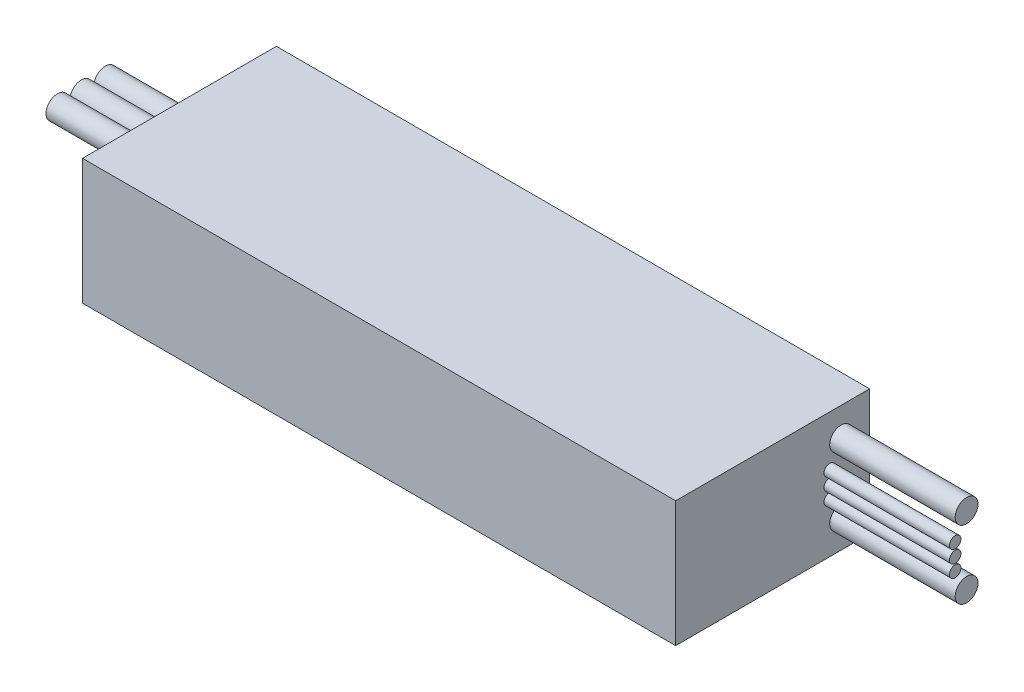
ISO-10303-21;
HEADER;
FILE_DESCRIPTION(('STEP AP214'),'2;1');
FILE_NAME('part.step','',(''),(''),'','','');
FILE_SCHEMA(('AUTOMOTIVE_DESIGN { 1 0 10303 214 1 1 1 1 }'));
ENDSEC;
DATA;
#1=APPLICATION_CONTEXT('core data for automotive mechanical design processes');
#2=APPLICATION_PROTOCOL_DEFINITION('international standard','automotive_design',2000,#1);
#3=PRODUCT_CONTEXT('',#1,'mechanical');
#4=PRODUCT('Part','Part','',(#3));
#5=PRODUCT_RELATED_PRODUCT_CATEGORY('part','',(#4));
#6=PRODUCT_DEFINITION_FORMATION('','',#4);
#7=PRODUCT_DEFINITION_CONTEXT('part definition',#1,'design');
#8=PRODUCT_DEFINITION('design','',#6,#7);
#9=PRODUCT_DEFINITION_SHAPE('','',#8);
#10=(LENGTH_UNIT() NAMED_UNIT(*) SI_UNIT(.MILLI.,.METRE.));
#11=(NAMED_UNIT(*) PLANE_ANGLE_UNIT() SI_UNIT($,.RADIAN.));
#12=(NAMED_UNIT(*) SI_UNIT($,.STERADIAN.) SOLID_ANGLE_UNIT());
#13=UNCERTAINTY_MEASURE_WITH_UNIT(LENGTH_MEASURE(1.E-05),#10,'distance_accuracy_value','');
#14=(GEOMETRIC_REPRESENTATION_CONTEXT(3) GLOBAL_UNCERTAINTY_ASSIGNED_CONTEXT((#13)) GLOBAL_UNIT_ASSIGNED_CONTEXT((#10,
#11,#12)) REPRESENTATION_CONTEXT('',''));
#15=CARTESIAN_POINT('',(0.,0.,0.));
#16=DIRECTION('',(0.,0.,1.));
#17=DIRECTION('',(1.,0.,0.));
#18=AXIS2_PLACEMENT_3D('',#15,#16,#17);
#19=CARTESIAN_POINT('',(0.,11.,0.));
#20=DIRECTION('',(1.,0.,0.));
#21=DIRECTION('',(0.,0.,-1.));
#22=AXIS2_PLACEMENT_3D('',#19,#20,#21);
#23=PLANE('',#22);
#24=CARTESIAN_POINT('',(0.,5.,-8.8));
#25=DIRECTION('',(1.,0.,0.));
#26=DIRECTION('',(0.,0.,-1.));
#27=AXIS2_PLACEMENT_3D('',#24,#25,#26);
#28=CIRCLE('',#27,1.);
#29=CARTESIAN_POINT('',(0.,5.,-9.8));
#30=VERTEX_POINT('',#29);
#31=EDGE_CURVE('E120',#30,#30,#28,.F.);
#32=ORIENTED_EDGE('',*,*,#31,.F.);
#33=EDGE_LOOP('',(#32));
#34=FACE_BOUND('',#33,.T.);
#35=CARTESIAN_POINT('',(0.,5.,-10.9));
#36=DIRECTION('',(1.,0.,0.));
#37=DIRECTION('',(0.,0.,-1.));
#38=AXIS2_PLACEMENT_3D('',#35,#36,#37);
#39=CIRCLE('',#38,1.);
#40=CARTESIAN_POINT('',(0.,5.,-11.9));
#41=VERTEX_POINT('',#40);
#42=EDGE_CURVE('E117',#41,#41,#39,.F.);
#43=ORIENTED_EDGE('',*,*,#42,.F.);
#44=EDGE_LOOP('',(#43));
#45=FACE_BOUND('',#44,.T.);
#46=CARTESIAN_POINT('',(0.,5.,-13.));
#47=DIRECTION('',(1.,0.,0.));
#48=DIRECTION('',(0.,0.,-1.));
#49=AXIS2_PLACEMENT_3D('',#46,#47,#48);
#50=CIRCLE('',#49,1.);
#51=CARTESIAN_POINT('',(0.,5.,-14.));
#52=VERTEX_POINT('',#51);
#53=EDGE_CURVE('E114',#52,#52,#50,.F.);
#54=ORIENTED_EDGE('',*,*,#53,.F.);
#55=EDGE_LOOP('',(#54));
#56=FACE_BOUND('',#55,.T.);
#57=DIRECTION('',(0.,0.,1.));
#58=VECTOR('',#57,1.);
#59=CARTESIAN_POINT('',(0.,0.,0.));
#60=LINE('',#59,#58);
#61=CARTESIAN_POINT('',(0.,0.,-17.));
#62=VERTEX_POINT('',#61);
#63=CARTESIAN_POINT('',(0.,0.,0.));
#64=VERTEX_POINT('',#63);
#65=EDGE_CURVE('E104',#62,#64,#60,.T.);
#66=ORIENTED_EDGE('',*,*,#65,.T.);
#67=DIRECTION('',(0.,-1.,0.));
#68=VECTOR('',#67,1.);
#69=CARTESIAN_POINT('',(0.,11.,0.));
#70=LINE('',#69,#68);
#71=CARTESIAN_POINT('',(0.,11.,0.));
#72=VERTEX_POINT('',#71);
#73=EDGE_CURVE('E95',#72,#64,#70,.T.);
#74=ORIENTED_EDGE('',*,*,#73,.F.);
#75=DIRECTION('',(0.,0.,1.));
#76=VECTOR('',#75,1.);
#77=CARTESIAN_POINT('',(0.,11.,0.));
#78=LINE('',#77,#76);
#79=CARTESIAN_POINT('',(0.,11.,-17.));
#80=VERTEX_POINT('',#79);
#81=EDGE_CURVE('E89',#80,#72,#78,.T.);
#82=ORIENTED_EDGE('',*,*,#81,.F.);
#83=DIRECTION('',(0.,-1.,0.));
#84=VECTOR('',#83,1.);
#85=CARTESIAN_POINT('',(0.,11.,-17.));
#86=LINE('',#85,#84);
#87=EDGE_CURVE('E100',#80,#62,#86,.T.);
#88=ORIENTED_EDGE('',*,*,#87,.T.);
#89=EDGE_LOOP('',(#66,#74,#82,#88));
#90=FACE_BOUND('',#89,.T.);
#91=ADVANCED_FACE('F37',(#34,#45,#56,#90),#23,.F.);
#92=CARTESIAN_POINT('',(0.,11.,0.));
#93=DIRECTION('',(0.,0.,-1.));
#94=DIRECTION('',(-1.,0.,0.));
#95=AXIS2_PLACEMENT_3D('',#92,#93,#94);
#96=PLANE('',#95);
#97=DIRECTION('',(1.,0.,0.));
#98=VECTOR('',#97,1.);
#99=CARTESIAN_POINT('',(0.,0.,0.));
#100=LINE('',#99,#98);
#101=CARTESIAN_POINT('',(52.,0.,0.));
#102=VERTEX_POINT('',#101);
#103=EDGE_CURVE('E94',#64,#102,#100,.T.);
#104=ORIENTED_EDGE('',*,*,#103,.T.);
#105=DIRECTION('',(0.,-1.,0.));
#106=VECTOR('',#105,1.);
#107=CARTESIAN_POINT('',(52.,11.,0.));
#108=LINE('',#107,#106);
#109=CARTESIAN_POINT('',(52.,11.,0.));
#110=VERTEX_POINT('',#109);
#111=EDGE_CURVE('E92',#110,#102,#108,.T.);
#112=ORIENTED_EDGE('',*,*,#111,.F.);
#113=DIRECTION('',(1.,0.,0.));
#114=VECTOR('',#113,1.);
#115=CARTESIAN_POINT('',(0.,11.,0.));
#116=LINE('',#115,#114);
#117=EDGE_CURVE('E84',#72,#110,#116,.T.);
#118=ORIENTED_EDGE('',*,*,#117,.F.);
#119=ORIENTED_EDGE('',*,*,#73,.T.);
#120=EDGE_LOOP('',(#104,#112,#118,#119));
#121=FACE_BOUND('',#120,.T.);
#122=ADVANCED_FACE('F93',(#121),#96,.F.);
#123=CARTESIAN_POINT('',(52.,11.,0.));
#124=DIRECTION('',(-1.,0.,0.));
#125=DIRECTION('',(0.,0.,1.));
#126=AXIS2_PLACEMENT_3D('',#123,#124,#125);
#127=PLANE('',#126);
#128=CARTESIAN_POINT('',(52.,4.4,-13.5));
#129=DIRECTION('',(-1.,0.,0.));
#130=DIRECTION('',(0.,0.,1.));
#131=AXIS2_PLACEMENT_3D('',#128,#129,#130);
#132=CIRCLE('',#131,0.500000000000001);
#133=CARTESIAN_POINT('',(52.,4.4,-13.));
#134=VERTEX_POINT('',#133);
#135=EDGE_CURVE('E11',#134,#134,#132,.F.);
#136=ORIENTED_EDGE('',*,*,#135,.F.);
#137=EDGE_LOOP('',(#136));
#138=FACE_BOUND('',#137,.T.);
#139=CARTESIAN_POINT('',(52.,5.5,-13.5));
#140=DIRECTION('',(-1.,0.,0.));
#141=DIRECTION('',(0.,0.,1.));
#142=AXIS2_PLACEMENT_3D('',#139,#140,#141);
#143=CIRCLE('',#142,0.500000000000001);
#144=CARTESIAN_POINT('',(52.,5.5,-13.));
#145=VERTEX_POINT('',#144);
#146=EDGE_CURVE('E45',#145,#145,#143,.F.);
#147=ORIENTED_EDGE('',*,*,#146,.F.);
#148=EDGE_LOOP('',(#147));
#149=FACE_BOUND('',#148,.T.);
#150=CARTESIAN_POINT('',(52.,6.6,-13.5));
#151=DIRECTION('',(-1.,0.,0.));
#152=DIRECTION('',(0.,0.,1.));
#153=AXIS2_PLACEMENT_3D('',#150,#151,#152);
#154=CIRCLE('',#153,0.500000000000001);
#155=CARTESIAN_POINT('',(52.,6.6,-13.));
#156=VERTEX_POINT('',#155);
#157=EDGE_CURVE('E129',#156,#156,#154,.F.);
#158=ORIENTED_EDGE('',*,*,#157,.F.);
#159=EDGE_LOOP('',(#158));
#160=FACE_BOUND('',#159,.T.);
#161=CARTESIAN_POINT('',(52.,2.5,-14.5));
#162=DIRECTION('',(-1.,0.,0.));
#163=DIRECTION('',(0.,0.,1.));
#164=AXIS2_PLACEMENT_3D('',#161,#162,#163);
#165=CIRCLE('',#164,1.);
#166=CARTESIAN_POINT('',(52.,2.5,-13.5));
#167=VERTEX_POINT('',#166);
#168=EDGE_CURVE('E126',#167,#167,#165,.F.);
#169=ORIENTED_EDGE('',*,*,#168,.F.);
#170=EDGE_LOOP('',(#169));
#171=FACE_BOUND('',#170,.T.);
#172=CARTESIAN_POINT('',(52.,8.5,-14.5));
#173=DIRECTION('',(-1.,0.,0.));
#174=DIRECTION('',(0.,0.,1.));
#175=AXIS2_PLACEMENT_3D('',#172,#173,#174);
#176=CIRCLE('',#175,0.999999999999999);
#177=CARTESIAN_POINT('',(52.,8.5,-13.5));
#178=VERTEX_POINT('',#177);
#179=EDGE_CURVE('E123',#178,#178,#176,.F.);
#180=ORIENTED_EDGE('',*,*,#179,.F.);
#181=EDGE_LOOP('',(#180));
#182=FACE_BOUND('',#181,.T.);
#183=DIRECTION('',(0.,0.,-1.));
#184=VECTOR('',#183,1.);
#185=CARTESIAN_POINT('',(52.,0.,0.));
#186=LINE('',#185,#184);
#187=CARTESIAN_POINT('',(52.,0.,-17.));
#188=VERTEX_POINT('',#187);
#189=EDGE_CURVE('E70',#102,#188,#186,.T.);
#190=ORIENTED_EDGE('',*,*,#189,.T.);
#191=DIRECTION('',(0.,-1.,0.));
#192=VECTOR('',#191,1.);
#193=CARTESIAN_POINT('',(52.,11.,-17.));
#194=LINE('',#193,#192);
#195=CARTESIAN_POINT('',(52.,11.,-17.));
#196=VERTEX_POINT('',#195);
#197=EDGE_CURVE('E96',#196,#188,#194,.T.);
#198=ORIENTED_EDGE('',*,*,#197,.F.);
#199=DIRECTION('',(0.,0.,-1.));
#200=VECTOR('',#199,1.);
#201=CARTESIAN_POINT('',(52.,11.,0.));
#202=LINE('',#201,#200);
#203=EDGE_CURVE('E87',#110,#196,#202,.T.);
#204=ORIENTED_EDGE('',*,*,#203,.F.);
#205=ORIENTED_EDGE('',*,*,#111,.T.);
#206=EDGE_LOOP('',(#190,#198,#204,#205));
#207=FACE_BOUND('',#206,.T.);
#208=ADVANCED_FACE('F98',(#138,#149,#160,#171,#182,#207),#127,.F.);
#209=CARTESIAN_POINT('',(0.,11.,-17.));
#210=DIRECTION('',(0.,0.,1.));
#211=DIRECTION('',(1.,0.,0.));
#212=AXIS2_PLACEMENT_3D('',#209,#210,#211);
#213=PLANE('',#212);
#214=DIRECTION('',(-1.,0.,0.));
#215=VECTOR('',#214,1.);
#216=CARTESIAN_POINT('',(0.,0.,-17.));
#217=LINE('',#216,#215);
#218=EDGE_CURVE('E76',#188,#62,#217,.T.);
#219=ORIENTED_EDGE('',*,*,#218,.T.);
#220=ORIENTED_EDGE('',*,*,#87,.F.);
#221=DIRECTION('',(-1.,0.,0.));
#222=VECTOR('',#221,1.);
#223=CARTESIAN_POINT('',(0.,11.,-17.));
#224=LINE('',#223,#222);
#225=EDGE_CURVE('E53',#196,#80,#224,.T.);
#226=ORIENTED_EDGE('',*,*,#225,.F.);
#227=ORIENTED_EDGE('',*,*,#197,.T.);
#228=EDGE_LOOP('',(#219,#220,#226,#227));
#229=FACE_BOUND('',#228,.T.);
#230=ADVANCED_FACE('F138',(#229),#213,.F.);
#231=CARTESIAN_POINT('',(0.,11.,0.));
#232=DIRECTION('',(0.,-1.,0.));
#233=DIRECTION('',(0.,0.,-1.));
#234=AXIS2_PLACEMENT_3D('',#231,#232,#233);
#235=PLANE('',#234);
#236=ORIENTED_EDGE('',*,*,#81,.T.);
#237=ORIENTED_EDGE('',*,*,#117,.T.);
#238=ORIENTED_EDGE('',*,*,#203,.T.);
#239=ORIENTED_EDGE('',*,*,#225,.T.);
#240=EDGE_LOOP('',(#236,#237,#238,#239));
#241=FACE_BOUND('',#240,.T.);
#242=ADVANCED_FACE('F85',(#241),#235,.F.);
#243=CARTESIAN_POINT('',(0.,0.,0.));
#244=DIRECTION('',(0.,-1.,0.));
#245=DIRECTION('',(0.,0.,-1.));
#246=AXIS2_PLACEMENT_3D('',#243,#244,#245);
#247=PLANE('',#246);
#248=ORIENTED_EDGE('',*,*,#65,.F.);
#249=ORIENTED_EDGE('',*,*,#218,.F.);
#250=ORIENTED_EDGE('',*,*,#189,.F.);
#251=ORIENTED_EDGE('',*,*,#103,.F.);
#252=EDGE_LOOP('',(#248,#249,#250,#251));
#253=FACE_BOUND('',#252,.T.);
#254=ADVANCED_FACE('F177',(#253),#247,.T.);
#255=CARTESIAN_POINT('',(-11.,5.,-13.));
#256=DIRECTION('',(1.,0.,0.));
#257=DIRECTION('',(0.,0.,-1.));
#258=AXIS2_PLACEMENT_3D('',#255,#256,#257);
#259=CYLINDRICAL_SURFACE('',#258,1.);
#260=CARTESIAN_POINT('',(-11.,5.,-13.));
#261=DIRECTION('',(-1.,0.,0.));
#262=DIRECTION('',(0.,0.,1.));
#263=AXIS2_PLACEMENT_3D('',#260,#261,#262);
#264=CIRCLE('',#263,1.);
#265=CARTESIAN_POINT('',(-11.,5.,-12.));
#266=VERTEX_POINT('',#265);
#267=EDGE_CURVE('E107',#266,#266,#264,.T.);
#268=ORIENTED_EDGE('',*,*,#267,.F.);
#269=EDGE_LOOP('',(#268));
#270=FACE_BOUND('',#269,.T.);
#271=ORIENTED_EDGE('',*,*,#53,.T.);
#272=EDGE_LOOP('',(#271));
#273=FACE_BOUND('',#272,.T.);
#274=ADVANCED_FACE('F179',(#270,#273),#259,.T.);
#275=CARTESIAN_POINT('',(-11.,5.,-13.));
#276=DIRECTION('',(-1.,0.,0.));
#277=DIRECTION('',(0.,0.,1.));
#278=AXIS2_PLACEMENT_3D('',#275,#276,#277);
#279=PLANE('',#278);
#280=ORIENTED_EDGE('',*,*,#267,.T.);
#281=EDGE_LOOP('',(#280));
#282=FACE_BOUND('',#281,.T.);
#283=ADVANCED_FACE('F185',(#282),#279,.T.);
#284=CARTESIAN_POINT('',(-11.,5.,-10.9));
#285=DIRECTION('',(1.,0.,0.));
#286=DIRECTION('',(0.,0.,-1.));
#287=AXIS2_PLACEMENT_3D('',#284,#285,#286);
#288=CYLINDRICAL_SURFACE('',#287,1.);
#289=CARTESIAN_POINT('',(-11.,5.,-10.9));
#290=DIRECTION('',(-1.,0.,0.));
#291=DIRECTION('',(0.,0.,1.));
#292=AXIS2_PLACEMENT_3D('',#289,#290,#291);
#293=CIRCLE('',#292,1.);
#294=CARTESIAN_POINT('',(-11.,5.,-9.9));
#295=VERTEX_POINT('',#294);
#296=EDGE_CURVE('E375',#295,#295,#293,.T.);
#297=ORIENTED_EDGE('',*,*,#296,.F.);
#298=EDGE_LOOP('',(#297));
#299=FACE_BOUND('',#298,.T.);
#300=ORIENTED_EDGE('',*,*,#42,.T.);
#301=EDGE_LOOP('',(#300));
#302=FACE_BOUND('',#301,.T.);
#303=ADVANCED_FACE('F224',(#299,#302),#288,.T.);
#304=CARTESIAN_POINT('',(-11.,5.,-10.9));
#305=DIRECTION('',(-1.,0.,0.));
#306=DIRECTION('',(0.,0.,1.));
#307=AXIS2_PLACEMENT_3D('',#304,#305,#306);
#308=PLANE('',#307);
#309=ORIENTED_EDGE('',*,*,#296,.T.);
#310=EDGE_LOOP('',(#309));
#311=FACE_BOUND('',#310,.T.);
#312=ADVANCED_FACE('F234',(#311),#308,.T.);
#313=CARTESIAN_POINT('',(-11.,5.,-8.8));
#314=DIRECTION('',(1.,0.,0.));
#315=DIRECTION('',(0.,0.,-1.));
#316=AXIS2_PLACEMENT_3D('',#313,#314,#315);
#317=CYLINDRICAL_SURFACE('',#316,1.);
#318=CARTESIAN_POINT('',(-11.,5.,-8.8));
#319=DIRECTION('',(-1.,0.,0.));
#320=DIRECTION('',(0.,0.,1.));
#321=AXIS2_PLACEMENT_3D('',#318,#319,#320);
#322=CIRCLE('',#321,1.);
#323=CARTESIAN_POINT('',(-11.,5.,-7.8));
#324=VERTEX_POINT('',#323);
#325=EDGE_CURVE('E372',#324,#324,#322,.T.);
#326=ORIENTED_EDGE('',*,*,#325,.F.);
#327=EDGE_LOOP('',(#326));
#328=FACE_BOUND('',#327,.T.);
#329=ORIENTED_EDGE('',*,*,#31,.T.);
#330=EDGE_LOOP('',(#329));
#331=FACE_BOUND('',#330,.T.);
#332=ADVANCED_FACE('F160',(#328,#331),#317,.T.);
#333=CARTESIAN_POINT('',(-11.,5.,-8.8));
#334=DIRECTION('',(-1.,0.,0.));
#335=DIRECTION('',(0.,0.,1.));
#336=AXIS2_PLACEMENT_3D('',#333,#334,#335);
#337=PLANE('',#336);
#338=ORIENTED_EDGE('',*,*,#325,.T.);
#339=EDGE_LOOP('',(#338));
#340=FACE_BOUND('',#339,.T.);
#341=ADVANCED_FACE('F150',(#340),#337,.T.);
#342=CARTESIAN_POINT('',(63.,8.5,-14.5));
#343=DIRECTION('',(-1.,0.,0.));
#344=DIRECTION('',(0.,0.,1.));
#345=AXIS2_PLACEMENT_3D('',#342,#343,#344);
#346=CYLINDRICAL_SURFACE('',#345,0.999999999999999);
#347=CARTESIAN_POINT('',(63.,8.5,-14.5));
#348=DIRECTION('',(1.,0.,0.));
#349=DIRECTION('',(0.,0.,-1.));
#350=AXIS2_PLACEMENT_3D('',#347,#348,#349);
#351=CIRCLE('',#350,0.999999999999999);
#352=CARTESIAN_POINT('',(63.,8.5,-15.5));
#353=VERTEX_POINT('',#352);
#354=EDGE_CURVE('E369',#353,#353,#351,.T.);
#355=ORIENTED_EDGE('',*,*,#354,.F.);
#356=EDGE_LOOP('',(#355));
#357=FACE_BOUND('',#356,.T.);
#358=ORIENTED_EDGE('',*,*,#179,.T.);
#359=EDGE_LOOP('',(#358));
#360=FACE_BOUND('',#359,.T.);
#361=ADVANCED_FACE('F147',(#357,#360),#346,.T.);
#362=CARTESIAN_POINT('',(63.,8.5,-14.5));
#363=DIRECTION('',(1.,0.,0.));
#364=DIRECTION('',(0.,0.,-1.));
#365=AXIS2_PLACEMENT_3D('',#362,#363,#364);
#366=PLANE('',#365);
#367=ORIENTED_EDGE('',*,*,#354,.T.);
#368=EDGE_LOOP('',(#367));
#369=FACE_BOUND('',#368,.T.);
#370=ADVANCED_FACE('F149',(#369),#366,.T.);
#371=CARTESIAN_POINT('',(63.,2.5,-14.5));
#372=DIRECTION('',(-1.,0.,0.));
#373=DIRECTION('',(0.,0.,1.));
#374=AXIS2_PLACEMENT_3D('',#371,#372,#373);
#375=CYLINDRICAL_SURFACE('',#374,1.);
#376=CARTESIAN_POINT('',(63.,2.5,-14.5));
#377=DIRECTION('',(1.,0.,0.));
#378=DIRECTION('',(0.,0.,-1.));
#379=AXIS2_PLACEMENT_3D('',#376,#377,#378);
#380=CIRCLE('',#379,1.);
#381=CARTESIAN_POINT('',(63.,2.5,-15.5));
#382=VERTEX_POINT('',#381);
#383=EDGE_CURVE('E366',#382,#382,#380,.T.);
#384=ORIENTED_EDGE('',*,*,#383,.F.);
#385=EDGE_LOOP('',(#384));
#386=FACE_BOUND('',#385,.T.);
#387=ORIENTED_EDGE('',*,*,#168,.T.);
#388=EDGE_LOOP('',(#387));
#389=FACE_BOUND('',#388,.T.);
#390=ADVANCED_FACE('F157',(#386,#389),#375,.T.);
#391=CARTESIAN_POINT('',(63.,2.5,-14.5));
#392=DIRECTION('',(1.,0.,0.));
#393=DIRECTION('',(0.,0.,-1.));
#394=AXIS2_PLACEMENT_3D('',#391,#392,#393);
#395=PLANE('',#394);
#396=ORIENTED_EDGE('',*,*,#383,.T.);
#397=EDGE_LOOP('',(#396));
#398=FACE_BOUND('',#397,.T.);
#399=ADVANCED_FACE('F282',(#398),#395,.T.);
#400=CARTESIAN_POINT('',(63.,6.6,-13.5));
#401=DIRECTION('',(-1.,0.,0.));
#402=DIRECTION('',(0.,0.,1.));
#403=AXIS2_PLACEMENT_3D('',#400,#401,#402);
#404=CYLINDRICAL_SURFACE('',#403,0.500000000000001);
#405=CARTESIAN_POINT('',(63.,6.6,-13.5));
#406=DIRECTION('',(1.,0.,0.));
#407=DIRECTION('',(0.,0.,-1.));
#408=AXIS2_PLACEMENT_3D('',#405,#406,#407);
#409=CIRCLE('',#408,0.500000000000001);
#410=CARTESIAN_POINT('',(63.,6.6,-14.));
#411=VERTEX_POINT('',#410);
#412=EDGE_CURVE('E361',#411,#411,#409,.T.);
#413=ORIENTED_EDGE('',*,*,#412,.F.);
#414=EDGE_LOOP('',(#413));
#415=FACE_BOUND('',#414,.T.);
#416=ORIENTED_EDGE('',*,*,#157,.T.);
#417=EDGE_LOOP('',(#416));
#418=FACE_BOUND('',#417,.T.);
#419=ADVANCED_FACE('F292',(#415,#418),#404,.T.);
#420=CARTESIAN_POINT('',(63.,6.6,-13.5));
#421=DIRECTION('',(1.,0.,0.));
#422=DIRECTION('',(0.,0.,-1.));
#423=AXIS2_PLACEMENT_3D('',#420,#421,#422);
#424=PLANE('',#423);
#425=ORIENTED_EDGE('',*,*,#412,.T.);
#426=EDGE_LOOP('',(#425));
#427=FACE_BOUND('',#426,.T.);
#428=ADVANCED_FACE('F302',(#427),#424,.T.);
#429=CARTESIAN_POINT('',(63.,5.5,-13.5));
#430=DIRECTION('',(-1.,0.,0.));
#431=DIRECTION('',(0.,0.,1.));
#432=AXIS2_PLACEMENT_3D('',#429,#430,#431);
#433=CYLINDRICAL_SURFACE('',#432,0.500000000000001);
#434=CARTESIAN_POINT('',(63.,5.5,-13.5));
#435=DIRECTION('',(1.,0.,0.));
#436=DIRECTION('',(0.,0.,-1.));
#437=AXIS2_PLACEMENT_3D('',#434,#435,#436);
#438=CIRCLE('',#437,0.500000000000001);
#439=CARTESIAN_POINT('',(63.,5.5,-14.));
#440=VERTEX_POINT('',#439);
#441=EDGE_CURVE('E358',#440,#440,#438,.T.);
#442=ORIENTED_EDGE('',*,*,#441,.F.);
#443=EDGE_LOOP('',(#442));
#444=FACE_BOUND('',#443,.T.);
#445=ORIENTED_EDGE('',*,*,#146,.T.);
#446=EDGE_LOOP('',(#445));
#447=FACE_BOUND('',#446,.T.);
#448=ADVANCED_FACE('F134',(#444,#447),#433,.T.);
#449=CARTESIAN_POINT('',(63.,5.5,-13.5));
#450=DIRECTION('',(1.,0.,0.));
#451=DIRECTION('',(0.,0.,-1.));
#452=AXIS2_PLACEMENT_3D('',#449,#450,#451);
#453=PLANE('',#452);
#454=ORIENTED_EDGE('',*,*,#441,.T.);
#455=EDGE_LOOP('',(#454));
#456=FACE_BOUND('',#455,.T.);
#457=ADVANCED_FACE('F321',(#456),#453,.T.);
#458=CARTESIAN_POINT('',(63.,4.4,-13.5));
#459=DIRECTION('',(-1.,0.,0.));
#460=DIRECTION('',(0.,0.,1.));
#461=AXIS2_PLACEMENT_3D('',#458,#459,#460);
#462=CYLINDRICAL_SURFACE('',#461,0.500000000000001);
#463=CARTESIAN_POINT('',(63.,4.4,-13.5));
#464=DIRECTION('',(1.,0.,0.));
#465=DIRECTION('',(0.,0.,-1.));
#466=AXIS2_PLACEMENT_3D('',#463,#464,#465);
#467=CIRCLE('',#466,0.500000000000001);
#468=CARTESIAN_POINT('',(63.,4.4,-14.));
#469=VERTEX_POINT('',#468);
#470=EDGE_CURVE('E357',#469,#469,#467,.T.);
#471=ORIENTED_EDGE('',*,*,#470,.F.);
#472=EDGE_LOOP('',(#471));
#473=FACE_BOUND('',#472,.T.);
#474=ORIENTED_EDGE('',*,*,#135,.T.);
#475=EDGE_LOOP('',(#474));
#476=FACE_BOUND('',#475,.T.);
#477=ADVANCED_FACE('F331',(#473,#476),#462,.T.);
#478=CARTESIAN_POINT('',(63.,4.4,-13.5));
#479=DIRECTION('',(1.,0.,0.));
#480=DIRECTION('',(0.,0.,-1.));
#481=AXIS2_PLACEMENT_3D('',#478,#479,#480);
#482=PLANE('',#481);
#483=ORIENTED_EDGE('',*,*,#470,.T.);
#484=EDGE_LOOP('',(#483));
#485=FACE_BOUND('',#484,.T.);
#486=ADVANCED_FACE('F341',(#485),#482,.T.);
#487=CLOSED_SHELL('',(#91,#122,#208,#230,#242,#254,#274,#283,#303,#312,#332,#341,#361,#370,#390,
#399,#419,#428,#448,#457,#477,#486));
#488=MANIFOLD_SOLID_BREP('B2',#487);
#489=ADVANCED_BREP_SHAPE_REPRESENTATION('',(#18,#488),#14);
#490=SHAPE_DEFINITION_REPRESENTATION(#9,#489);
ENDSEC;
END-ISO-10303-21;
